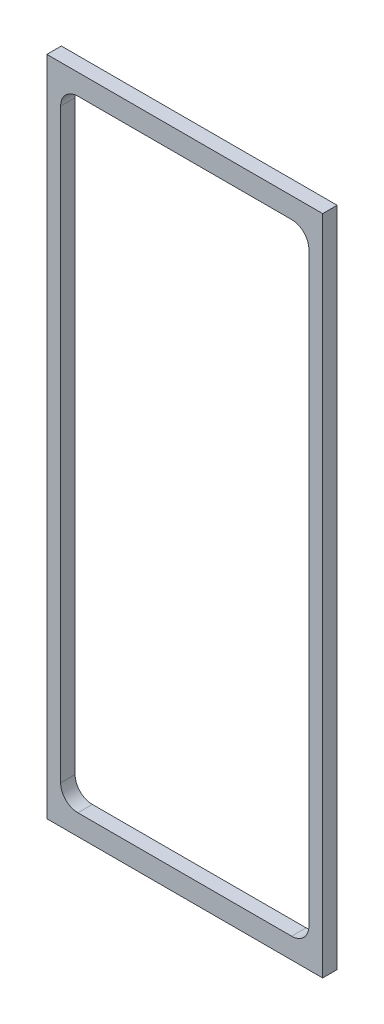
ISO-10303-21;
HEADER;
FILE_DESCRIPTION(('STEP AP214'),'2;1');
FILE_NAME('part.step','',(''),(''),'','','');
FILE_SCHEMA(('AUTOMOTIVE_DESIGN { 1 0 10303 214 1 1 1 1 }'));
ENDSEC;
DATA;
#1=APPLICATION_CONTEXT('core data for automotive mechanical design processes');
#2=APPLICATION_PROTOCOL_DEFINITION('international standard','automotive_design',2000,#1);
#3=PRODUCT_CONTEXT('',#1,'mechanical');
#4=PRODUCT('Part','Part','',(#3));
#5=PRODUCT_RELATED_PRODUCT_CATEGORY('part','',(#4));
#6=PRODUCT_DEFINITION_FORMATION('','',#4);
#7=PRODUCT_DEFINITION_CONTEXT('part definition',#1,'design');
#8=PRODUCT_DEFINITION('design','',#6,#7);
#9=PRODUCT_DEFINITION_SHAPE('','',#8);
#10=(LENGTH_UNIT() NAMED_UNIT(*) SI_UNIT(.MILLI.,.METRE.));
#11=(NAMED_UNIT(*) PLANE_ANGLE_UNIT() SI_UNIT($,.RADIAN.));
#12=(NAMED_UNIT(*) SI_UNIT($,.STERADIAN.) SOLID_ANGLE_UNIT());
#13=UNCERTAINTY_MEASURE_WITH_UNIT(LENGTH_MEASURE(1.E-05),#10,'distance_accuracy_value','');
#14=(GEOMETRIC_REPRESENTATION_CONTEXT(3) GLOBAL_UNCERTAINTY_ASSIGNED_CONTEXT((#13)) GLOBAL_UNIT_ASSIGNED_CONTEXT((#10,
#11,#12)) REPRESENTATION_CONTEXT('',''));
#15=CARTESIAN_POINT('',(0.,0.,0.));
#16=DIRECTION('',(0.,0.,1.));
#17=DIRECTION('',(1.,0.,0.));
#18=AXIS2_PLACEMENT_3D('',#15,#16,#17);
#19=CARTESIAN_POINT('',(25.4,-60.96,2.667));
#20=DIRECTION('',(-1.,0.,0.));
#21=DIRECTION('',(0.,0.,1.));
#22=AXIS2_PLACEMENT_3D('',#19,#20,#21);
#23=PLANE('',#22);
#24=DIRECTION('',(0.,1.,0.));
#25=VECTOR('',#24,1.);
#26=CARTESIAN_POINT('',(25.4,-60.96,0.));
#27=LINE('',#26,#25);
#28=CARTESIAN_POINT('',(25.4,-60.96,0.));
#29=VERTEX_POINT('',#28);
#30=CARTESIAN_POINT('',(25.4,60.96,0.));
#31=VERTEX_POINT('',#30);
#32=EDGE_CURVE('E177',#29,#31,#27,.T.);
#33=ORIENTED_EDGE('',*,*,#32,.T.);
#34=DIRECTION('',(0.,0.,-1.));
#35=VECTOR('',#34,1.);
#36=CARTESIAN_POINT('',(25.4,60.96,2.667));
#37=LINE('',#36,#35);
#38=CARTESIAN_POINT('',(25.4,60.96,2.667));
#39=VERTEX_POINT('',#38);
#40=EDGE_CURVE('E11',#39,#31,#37,.T.);
#41=ORIENTED_EDGE('',*,*,#40,.F.);
#42=DIRECTION('',(0.,1.,0.));
#43=VECTOR('',#42,1.);
#44=CARTESIAN_POINT('',(25.4,-60.96,2.667));
#45=LINE('',#44,#43);
#46=CARTESIAN_POINT('',(25.4,-60.96,2.667));
#47=VERTEX_POINT('',#46);
#48=EDGE_CURVE('E189',#47,#39,#45,.T.);
#49=ORIENTED_EDGE('',*,*,#48,.F.);
#50=DIRECTION('',(0.,0.,-1.));
#51=VECTOR('',#50,1.);
#52=CARTESIAN_POINT('',(25.4,-60.96,2.667));
#53=LINE('',#52,#51);
#54=EDGE_CURVE('E201',#47,#29,#53,.T.);
#55=ORIENTED_EDGE('',*,*,#54,.T.);
#56=EDGE_LOOP('',(#33,#41,#49,#55));
#57=FACE_BOUND('',#56,.T.);
#58=ADVANCED_FACE('F32',(#57),#23,.F.);
#59=CARTESIAN_POINT('',(25.4,60.96,2.667));
#60=DIRECTION('',(0.,-1.,0.));
#61=DIRECTION('',(1.,0.,0.));
#62=AXIS2_PLACEMENT_3D('',#59,#60,#61);
#63=PLANE('',#62);
#64=DIRECTION('',(-1.,0.,0.));
#65=VECTOR('',#64,1.);
#66=CARTESIAN_POINT('',(25.4,60.96,0.));
#67=LINE('',#66,#65);
#68=CARTESIAN_POINT('',(-25.4,60.96,0.));
#69=VERTEX_POINT('',#68);
#70=EDGE_CURVE('E204',#31,#69,#67,.T.);
#71=ORIENTED_EDGE('',*,*,#70,.T.);
#72=DIRECTION('',(0.,0.,-1.));
#73=VECTOR('',#72,1.);
#74=CARTESIAN_POINT('',(-25.4,60.96,2.667));
#75=LINE('',#74,#73);
#76=CARTESIAN_POINT('',(-25.4,60.96,2.667));
#77=VERTEX_POINT('',#76);
#78=EDGE_CURVE('E39',#77,#69,#75,.T.);
#79=ORIENTED_EDGE('',*,*,#78,.F.);
#80=DIRECTION('',(-1.,0.,0.));
#81=VECTOR('',#80,1.);
#82=CARTESIAN_POINT('',(25.4,60.96,2.667));
#83=LINE('',#82,#81);
#84=EDGE_CURVE('E192',#39,#77,#83,.T.);
#85=ORIENTED_EDGE('',*,*,#84,.F.);
#86=ORIENTED_EDGE('',*,*,#40,.T.);
#87=EDGE_LOOP('',(#71,#79,#85,#86));
#88=FACE_BOUND('',#87,.T.);
#89=ADVANCED_FACE('F220',(#88),#63,.F.);
#90=CARTESIAN_POINT('',(-25.4,-60.96,2.667));
#91=DIRECTION('',(-1.,0.,0.));
#92=DIRECTION('',(0.,0.,1.));
#93=AXIS2_PLACEMENT_3D('',#90,#91,#92);
#94=PLANE('',#93);
#95=DIRECTION('',(0.,1.,0.));
#96=VECTOR('',#95,1.);
#97=CARTESIAN_POINT('',(-25.4,-60.96,0.));
#98=LINE('',#97,#96);
#99=CARTESIAN_POINT('',(-25.4,-60.96,0.));
#100=VERTEX_POINT('',#99);
#101=EDGE_CURVE('E207',#100,#69,#98,.T.);
#102=ORIENTED_EDGE('',*,*,#101,.F.);
#103=DIRECTION('',(0.,0.,-1.));
#104=VECTOR('',#103,1.);
#105=CARTESIAN_POINT('',(-25.4,-60.96,2.667));
#106=LINE('',#105,#104);
#107=CARTESIAN_POINT('',(-25.4,-60.96,2.667));
#108=VERTEX_POINT('',#107);
#109=EDGE_CURVE('E213',#108,#100,#106,.T.);
#110=ORIENTED_EDGE('',*,*,#109,.F.);
#111=DIRECTION('',(0.,1.,0.));
#112=VECTOR('',#111,1.);
#113=CARTESIAN_POINT('',(-25.4,-60.96,2.667));
#114=LINE('',#113,#112);
#115=EDGE_CURVE('E195',#108,#77,#114,.T.);
#116=ORIENTED_EDGE('',*,*,#115,.T.);
#117=ORIENTED_EDGE('',*,*,#78,.T.);
#118=EDGE_LOOP('',(#102,#110,#116,#117));
#119=FACE_BOUND('',#118,.T.);
#120=ADVANCED_FACE('F217',(#119),#94,.T.);
#121=CARTESIAN_POINT('',(25.4,-60.96,2.667));
#122=DIRECTION('',(0.,-1.,0.));
#123=DIRECTION('',(0.,0.,-1.));
#124=AXIS2_PLACEMENT_3D('',#121,#122,#123);
#125=PLANE('',#124);
#126=DIRECTION('',(-1.,0.,0.));
#127=VECTOR('',#126,1.);
#128=CARTESIAN_POINT('',(25.4,-60.96,0.));
#129=LINE('',#128,#127);
#130=EDGE_CURVE('E193',#29,#100,#129,.T.);
#131=ORIENTED_EDGE('',*,*,#130,.F.);
#132=ORIENTED_EDGE('',*,*,#54,.F.);
#133=DIRECTION('',(-1.,0.,0.));
#134=VECTOR('',#133,1.);
#135=CARTESIAN_POINT('',(25.4,-60.96,2.667));
#136=LINE('',#135,#134);
#137=EDGE_CURVE('E198',#47,#108,#136,.T.);
#138=ORIENTED_EDGE('',*,*,#137,.T.);
#139=ORIENTED_EDGE('',*,*,#109,.T.);
#140=EDGE_LOOP('',(#131,#132,#138,#139));
#141=FACE_BOUND('',#140,.T.);
#142=ADVANCED_FACE('F225',(#141),#125,.T.);
#143=CARTESIAN_POINT('',(0.,0.,2.667));
#144=DIRECTION('',(0.,0.,1.));
#145=DIRECTION('',(1.,0.,0.));
#146=AXIS2_PLACEMENT_3D('',#143,#144,#145);
#147=PLANE('',#146);
#148=CARTESIAN_POINT('',(19.685,-53.975,2.667));
#149=DIRECTION('',(0.,0.,1.));
#150=DIRECTION('',(1.,0.,0.));
#151=AXIS2_PLACEMENT_3D('',#148,#149,#150);
#152=CIRCLE('',#151,3.175);
#153=CARTESIAN_POINT('',(19.685,-57.15,2.667));
#154=VERTEX_POINT('',#153);
#155=CARTESIAN_POINT('',(22.86,-53.975,2.667));
#156=VERTEX_POINT('',#155);
#157=EDGE_CURVE('E46',#154,#156,#152,.T.);
#158=ORIENTED_EDGE('',*,*,#157,.F.);
#159=DIRECTION('',(1.,0.,0.));
#160=VECTOR('',#159,1.);
#161=CARTESIAN_POINT('',(19.685,-57.15,2.667));
#162=LINE('',#161,#160);
#163=CARTESIAN_POINT('',(-19.685,-57.15,2.667));
#164=VERTEX_POINT('',#163);
#165=EDGE_CURVE('E139',#164,#154,#162,.T.);
#166=ORIENTED_EDGE('',*,*,#165,.F.);
#167=CARTESIAN_POINT('',(-19.685,-53.975,2.667));
#168=DIRECTION('',(0.,0.,1.));
#169=DIRECTION('',(1.,0.,0.));
#170=AXIS2_PLACEMENT_3D('',#167,#168,#169);
#171=CIRCLE('',#170,3.175);
#172=CARTESIAN_POINT('',(-22.86,-53.975,2.667));
#173=VERTEX_POINT('',#172);
#174=EDGE_CURVE('E142',#173,#164,#171,.T.);
#175=ORIENTED_EDGE('',*,*,#174,.F.);
#176=DIRECTION('',(0.,-1.,0.));
#177=VECTOR('',#176,1.);
#178=CARTESIAN_POINT('',(-22.86,-53.975,2.667));
#179=LINE('',#178,#177);
#180=CARTESIAN_POINT('',(-22.86,53.975,2.667));
#181=VERTEX_POINT('',#180);
#182=EDGE_CURVE('E170',#181,#173,#179,.T.);
#183=ORIENTED_EDGE('',*,*,#182,.F.);
#184=CARTESIAN_POINT('',(-19.685,53.975,2.667));
#185=DIRECTION('',(0.,0.,1.));
#186=DIRECTION('',(1.,0.,0.));
#187=AXIS2_PLACEMENT_3D('',#184,#185,#186);
#188=CIRCLE('',#187,3.175);
#189=CARTESIAN_POINT('',(-19.685,57.15,2.667));
#190=VERTEX_POINT('',#189);
#191=EDGE_CURVE('E167',#190,#181,#188,.T.);
#192=ORIENTED_EDGE('',*,*,#191,.F.);
#193=DIRECTION('',(-1.,0.,0.));
#194=VECTOR('',#193,1.);
#195=CARTESIAN_POINT('',(19.685,57.15,2.667));
#196=LINE('',#195,#194);
#197=CARTESIAN_POINT('',(19.685,57.15,2.667));
#198=VERTEX_POINT('',#197);
#199=EDGE_CURVE('E164',#198,#190,#196,.T.);
#200=ORIENTED_EDGE('',*,*,#199,.F.);
#201=CARTESIAN_POINT('',(19.685,53.975,2.667));
#202=DIRECTION('',(0.,0.,1.));
#203=DIRECTION('',(1.,0.,0.));
#204=AXIS2_PLACEMENT_3D('',#201,#202,#203);
#205=CIRCLE('',#204,3.175);
#206=CARTESIAN_POINT('',(22.86,53.975,2.667));
#207=VERTEX_POINT('',#206);
#208=EDGE_CURVE('E161',#207,#198,#205,.T.);
#209=ORIENTED_EDGE('',*,*,#208,.F.);
#210=DIRECTION('',(0.,1.,0.));
#211=VECTOR('',#210,1.);
#212=CARTESIAN_POINT('',(22.86,-53.975,2.667));
#213=LINE('',#212,#211);
#214=EDGE_CURVE('E159',#156,#207,#213,.T.);
#215=ORIENTED_EDGE('',*,*,#214,.F.);
#216=EDGE_LOOP('',(#158,#166,#175,#183,#192,#200,#209,#215));
#217=FACE_BOUND('',#216,.T.);
#218=ORIENTED_EDGE('',*,*,#48,.T.);
#219=ORIENTED_EDGE('',*,*,#84,.T.);
#220=ORIENTED_EDGE('',*,*,#115,.F.);
#221=ORIENTED_EDGE('',*,*,#137,.F.);
#222=EDGE_LOOP('',(#218,#219,#220,#221));
#223=FACE_BOUND('',#222,.T.);
#224=ADVANCED_FACE('F229',(#217,#223),#147,.T.);
#225=CARTESIAN_POINT('',(0.,0.,0.));
#226=DIRECTION('',(0.,0.,1.));
#227=DIRECTION('',(1.,0.,0.));
#228=AXIS2_PLACEMENT_3D('',#225,#226,#227);
#229=PLANE('',#228);
#230=DIRECTION('',(1.,0.,0.));
#231=VECTOR('',#230,1.);
#232=CARTESIAN_POINT('',(19.685,-57.15,0.));
#233=LINE('',#232,#231);
#234=CARTESIAN_POINT('',(-19.685,-57.15,0.));
#235=VERTEX_POINT('',#234);
#236=CARTESIAN_POINT('',(19.685,-57.15,0.));
#237=VERTEX_POINT('',#236);
#238=EDGE_CURVE('E128',#235,#237,#233,.T.);
#239=ORIENTED_EDGE('',*,*,#238,.T.);
#240=CARTESIAN_POINT('',(19.685,-53.975,0.));
#241=DIRECTION('',(0.,0.,1.));
#242=DIRECTION('',(1.,0.,0.));
#243=AXIS2_PLACEMENT_3D('',#240,#241,#242);
#244=CIRCLE('',#243,3.175);
#245=CARTESIAN_POINT('',(22.86,-53.975,0.));
#246=VERTEX_POINT('',#245);
#247=EDGE_CURVE('E122',#237,#246,#244,.T.);
#248=ORIENTED_EDGE('',*,*,#247,.T.);
#249=DIRECTION('',(0.,1.,0.));
#250=VECTOR('',#249,1.);
#251=CARTESIAN_POINT('',(22.86,-53.975,0.));
#252=LINE('',#251,#250);
#253=CARTESIAN_POINT('',(22.86,53.975,0.));
#254=VERTEX_POINT('',#253);
#255=EDGE_CURVE('E131',#246,#254,#252,.T.);
#256=ORIENTED_EDGE('',*,*,#255,.T.);
#257=CARTESIAN_POINT('',(19.685,53.975,0.));
#258=DIRECTION('',(0.,0.,1.));
#259=DIRECTION('',(1.,0.,0.));
#260=AXIS2_PLACEMENT_3D('',#257,#258,#259);
#261=CIRCLE('',#260,3.175);
#262=CARTESIAN_POINT('',(19.685,57.15,0.));
#263=VERTEX_POINT('',#262);
#264=EDGE_CURVE('E54',#254,#263,#261,.T.);
#265=ORIENTED_EDGE('',*,*,#264,.T.);
#266=DIRECTION('',(-1.,0.,0.));
#267=VECTOR('',#266,1.);
#268=CARTESIAN_POINT('',(19.685,57.15,0.));
#269=LINE('',#268,#267);
#270=CARTESIAN_POINT('',(-19.685,57.15,0.));
#271=VERTEX_POINT('',#270);
#272=EDGE_CURVE('E146',#263,#271,#269,.T.);
#273=ORIENTED_EDGE('',*,*,#272,.T.);
#274=CARTESIAN_POINT('',(-19.685,53.975,0.));
#275=DIRECTION('',(0.,0.,1.));
#276=DIRECTION('',(1.,0.,0.));
#277=AXIS2_PLACEMENT_3D('',#274,#275,#276);
#278=CIRCLE('',#277,3.175);
#279=CARTESIAN_POINT('',(-22.86,53.975,0.));
#280=VERTEX_POINT('',#279);
#281=EDGE_CURVE('E149',#271,#280,#278,.T.);
#282=ORIENTED_EDGE('',*,*,#281,.T.);
#283=DIRECTION('',(0.,-1.,0.));
#284=VECTOR('',#283,1.);
#285=CARTESIAN_POINT('',(-22.86,-53.975,0.));
#286=LINE('',#285,#284);
#287=CARTESIAN_POINT('',(-22.86,-53.975,0.));
#288=VERTEX_POINT('',#287);
#289=EDGE_CURVE('E152',#280,#288,#286,.T.);
#290=ORIENTED_EDGE('',*,*,#289,.T.);
#291=CARTESIAN_POINT('',(-19.685,-53.975,0.));
#292=DIRECTION('',(0.,0.,1.));
#293=DIRECTION('',(1.,0.,0.));
#294=AXIS2_PLACEMENT_3D('',#291,#292,#293);
#295=CIRCLE('',#294,3.175);
#296=EDGE_CURVE('E155',#288,#235,#295,.T.);
#297=ORIENTED_EDGE('',*,*,#296,.T.);
#298=EDGE_LOOP('',(#239,#248,#256,#265,#273,#282,#290,#297));
#299=FACE_BOUND('',#298,.T.);
#300=ORIENTED_EDGE('',*,*,#32,.F.);
#301=ORIENTED_EDGE('',*,*,#130,.T.);
#302=ORIENTED_EDGE('',*,*,#101,.T.);
#303=ORIENTED_EDGE('',*,*,#70,.F.);
#304=EDGE_LOOP('',(#300,#301,#302,#303));
#305=FACE_BOUND('',#304,.T.);
#306=ADVANCED_FACE('F135',(#299,#305),#229,.F.);
#307=CARTESIAN_POINT('',(19.685,-53.975,0.));
#308=DIRECTION('',(0.,0.,1.));
#309=DIRECTION('',(1.,0.,0.));
#310=AXIS2_PLACEMENT_3D('',#307,#308,#309);
#311=CYLINDRICAL_SURFACE('',#310,3.175);
#312=ORIENTED_EDGE('',*,*,#157,.T.);
#313=DIRECTION('',(0.,0.,1.));
#314=VECTOR('',#313,1.);
#315=CARTESIAN_POINT('',(22.86,-53.975,0.));
#316=LINE('',#315,#314);
#317=EDGE_CURVE('E118',#246,#156,#316,.T.);
#318=ORIENTED_EDGE('',*,*,#317,.F.);
#319=ORIENTED_EDGE('',*,*,#247,.F.);
#320=DIRECTION('',(0.,0.,1.));
#321=VECTOR('',#320,1.);
#322=CARTESIAN_POINT('',(19.685,-57.15,0.));
#323=LINE('',#322,#321);
#324=EDGE_CURVE('E175',#237,#154,#323,.T.);
#325=ORIENTED_EDGE('',*,*,#324,.T.);
#326=EDGE_LOOP('',(#312,#318,#319,#325));
#327=FACE_BOUND('',#326,.T.);
#328=ADVANCED_FACE('F120',(#327),#311,.F.);
#329=CARTESIAN_POINT('',(19.685,-57.15,0.));
#330=DIRECTION('',(0.,-1.,0.));
#331=DIRECTION('',(1.,0.,0.));
#332=AXIS2_PLACEMENT_3D('',#329,#330,#331);
#333=PLANE('',#332);
#334=ORIENTED_EDGE('',*,*,#165,.T.);
#335=ORIENTED_EDGE('',*,*,#324,.F.);
#336=ORIENTED_EDGE('',*,*,#238,.F.);
#337=DIRECTION('',(0.,0.,1.));
#338=VECTOR('',#337,1.);
#339=CARTESIAN_POINT('',(-19.685,-57.15,0.));
#340=LINE('',#339,#338);
#341=EDGE_CURVE('E178',#235,#164,#340,.T.);
#342=ORIENTED_EDGE('',*,*,#341,.T.);
#343=EDGE_LOOP('',(#334,#335,#336,#342));
#344=FACE_BOUND('',#343,.T.);
#345=ADVANCED_FACE('F249',(#344),#333,.F.);
#346=CARTESIAN_POINT('',(-19.685,-53.975,0.));
#347=DIRECTION('',(0.,0.,1.));
#348=DIRECTION('',(1.,0.,0.));
#349=AXIS2_PLACEMENT_3D('',#346,#347,#348);
#350=CYLINDRICAL_SURFACE('',#349,3.175);
#351=ORIENTED_EDGE('',*,*,#174,.T.);
#352=ORIENTED_EDGE('',*,*,#341,.F.);
#353=ORIENTED_EDGE('',*,*,#296,.F.);
#354=DIRECTION('',(0.,0.,1.));
#355=VECTOR('',#354,1.);
#356=CARTESIAN_POINT('',(-22.86,-53.975,0.));
#357=LINE('',#356,#355);
#358=EDGE_CURVE('E180',#288,#173,#357,.T.);
#359=ORIENTED_EDGE('',*,*,#358,.T.);
#360=EDGE_LOOP('',(#351,#352,#353,#359));
#361=FACE_BOUND('',#360,.T.);
#362=ADVANCED_FACE('F266',(#361),#350,.F.);
#363=CARTESIAN_POINT('',(-22.86,-53.975,0.));
#364=DIRECTION('',(-1.,0.,0.));
#365=DIRECTION('',(0.,0.,1.));
#366=AXIS2_PLACEMENT_3D('',#363,#364,#365);
#367=PLANE('',#366);
#368=ORIENTED_EDGE('',*,*,#182,.T.);
#369=ORIENTED_EDGE('',*,*,#358,.F.);
#370=ORIENTED_EDGE('',*,*,#289,.F.);
#371=DIRECTION('',(0.,0.,1.));
#372=VECTOR('',#371,1.);
#373=CARTESIAN_POINT('',(-22.86,53.975,0.));
#374=LINE('',#373,#372);
#375=EDGE_CURVE('E182',#280,#181,#374,.T.);
#376=ORIENTED_EDGE('',*,*,#375,.T.);
#377=EDGE_LOOP('',(#368,#369,#370,#376));
#378=FACE_BOUND('',#377,.T.);
#379=ADVANCED_FACE('F262',(#378),#367,.F.);
#380=CARTESIAN_POINT('',(-19.685,53.975,0.));
#381=DIRECTION('',(0.,0.,1.));
#382=DIRECTION('',(1.,0.,0.));
#383=AXIS2_PLACEMENT_3D('',#380,#381,#382);
#384=CYLINDRICAL_SURFACE('',#383,3.175);
#385=ORIENTED_EDGE('',*,*,#191,.T.);
#386=ORIENTED_EDGE('',*,*,#375,.F.);
#387=ORIENTED_EDGE('',*,*,#281,.F.);
#388=DIRECTION('',(0.,0.,1.));
#389=VECTOR('',#388,1.);
#390=CARTESIAN_POINT('',(-19.685,57.15,0.));
#391=LINE('',#390,#389);
#392=EDGE_CURVE('E184',#271,#190,#391,.T.);
#393=ORIENTED_EDGE('',*,*,#392,.T.);
#394=EDGE_LOOP('',(#385,#386,#387,#393));
#395=FACE_BOUND('',#394,.T.);
#396=ADVANCED_FACE('F258',(#395),#384,.F.);
#397=CARTESIAN_POINT('',(19.685,57.15,0.));
#398=DIRECTION('',(0.,1.,0.));
#399=DIRECTION('',(-1.,0.,0.));
#400=AXIS2_PLACEMENT_3D('',#397,#398,#399);
#401=PLANE('',#400);
#402=ORIENTED_EDGE('',*,*,#199,.T.);
#403=ORIENTED_EDGE('',*,*,#392,.F.);
#404=ORIENTED_EDGE('',*,*,#272,.F.);
#405=DIRECTION('',(0.,0.,1.));
#406=VECTOR('',#405,1.);
#407=CARTESIAN_POINT('',(19.685,57.15,0.));
#408=LINE('',#407,#406);
#409=EDGE_CURVE('E186',#263,#198,#408,.T.);
#410=ORIENTED_EDGE('',*,*,#409,.T.);
#411=EDGE_LOOP('',(#402,#403,#404,#410));
#412=FACE_BOUND('',#411,.T.);
#413=ADVANCED_FACE('F255',(#412),#401,.F.);
#414=CARTESIAN_POINT('',(19.685,53.975,0.));
#415=DIRECTION('',(0.,0.,1.));
#416=DIRECTION('',(1.,0.,0.));
#417=AXIS2_PLACEMENT_3D('',#414,#415,#416);
#418=CYLINDRICAL_SURFACE('',#417,3.175);
#419=ORIENTED_EDGE('',*,*,#208,.T.);
#420=ORIENTED_EDGE('',*,*,#409,.F.);
#421=ORIENTED_EDGE('',*,*,#264,.F.);
#422=DIRECTION('',(0.,0.,1.));
#423=VECTOR('',#422,1.);
#424=CARTESIAN_POINT('',(22.86,53.975,0.));
#425=LINE('',#424,#423);
#426=EDGE_CURVE('E127',#254,#207,#425,.T.);
#427=ORIENTED_EDGE('',*,*,#426,.T.);
#428=EDGE_LOOP('',(#419,#420,#421,#427));
#429=FACE_BOUND('',#428,.T.);
#430=ADVANCED_FACE('F252',(#429),#418,.F.);
#431=CARTESIAN_POINT('',(22.86,-53.975,0.));
#432=DIRECTION('',(1.,0.,0.));
#433=DIRECTION('',(0.,0.,-1.));
#434=AXIS2_PLACEMENT_3D('',#431,#432,#433);
#435=PLANE('',#434);
#436=ORIENTED_EDGE('',*,*,#214,.T.);
#437=ORIENTED_EDGE('',*,*,#426,.F.);
#438=ORIENTED_EDGE('',*,*,#255,.F.);
#439=ORIENTED_EDGE('',*,*,#317,.T.);
#440=EDGE_LOOP('',(#436,#437,#438,#439));
#441=FACE_BOUND('',#440,.T.);
#442=ADVANCED_FACE('F132',(#441),#435,.F.);
#443=CLOSED_SHELL('',(#58,#89,#120,#142,#224,#306,#328,#345,#362,#379,#396,#413,#430,#442));
#444=MANIFOLD_SOLID_BREP('B2',#443);
#445=ADVANCED_BREP_SHAPE_REPRESENTATION('',(#18,#444),#14);
#446=SHAPE_DEFINITION_REPRESENTATION(#9,#445);
ENDSEC;
END-ISO-10303-21;
